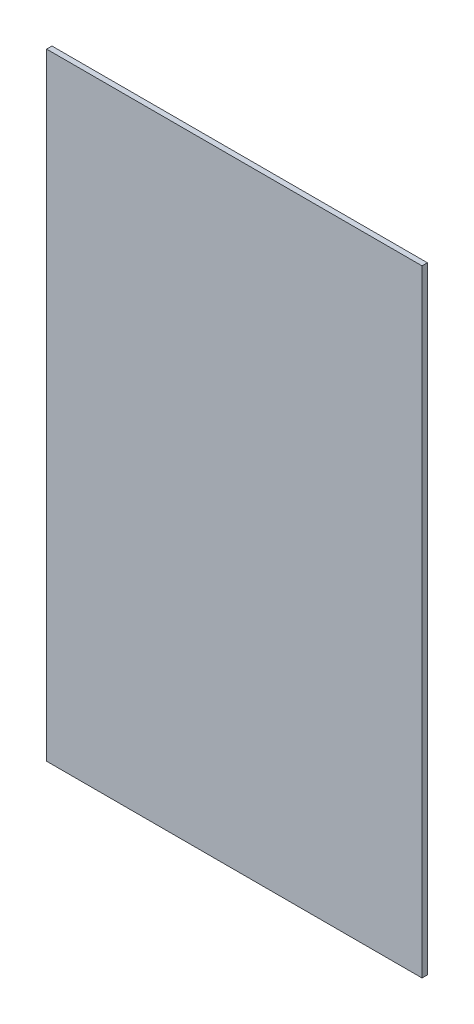
ISO-10303-21;
HEADER;
FILE_DESCRIPTION(('STEP AP214'),'2;1');
FILE_NAME('part.step','',(''),(''),'','','');
FILE_SCHEMA(('AUTOMOTIVE_DESIGN { 1 0 10303 214 1 1 1 1 }'));
ENDSEC;
DATA;
#1=APPLICATION_CONTEXT('core data for automotive mechanical design processes');
#2=APPLICATION_PROTOCOL_DEFINITION('international standard','automotive_design',2000,#1);
#3=PRODUCT_CONTEXT('',#1,'mechanical');
#4=PRODUCT('Part','Part','',(#3));
#5=PRODUCT_RELATED_PRODUCT_CATEGORY('part','',(#4));
#6=PRODUCT_DEFINITION_FORMATION('','',#4);
#7=PRODUCT_DEFINITION_CONTEXT('part definition',#1,'design');
#8=PRODUCT_DEFINITION('design','',#6,#7);
#9=PRODUCT_DEFINITION_SHAPE('','',#8);
#10=(LENGTH_UNIT() NAMED_UNIT(*) SI_UNIT(.MILLI.,.METRE.));
#11=(NAMED_UNIT(*) PLANE_ANGLE_UNIT() SI_UNIT($,.RADIAN.));
#12=(NAMED_UNIT(*) SI_UNIT($,.STERADIAN.) SOLID_ANGLE_UNIT());
#13=UNCERTAINTY_MEASURE_WITH_UNIT(LENGTH_MEASURE(1.E-05),#10,'distance_accuracy_value','');
#14=(GEOMETRIC_REPRESENTATION_CONTEXT(3) GLOBAL_UNCERTAINTY_ASSIGNED_CONTEXT((#13)) GLOBAL_UNIT_ASSIGNED_CONTEXT((#10,
#11,#12)) REPRESENTATION_CONTEXT('',''));
#15=CARTESIAN_POINT('',(0.,0.,0.));
#16=DIRECTION('',(0.,0.,1.));
#17=DIRECTION('',(1.,0.,0.));
#18=AXIS2_PLACEMENT_3D('',#15,#16,#17);
#19=CARTESIAN_POINT('',(-3.571428571429,3.85,0.132857142857));
#20=DIRECTION('',(0.,0.,1.));
#21=DIRECTION('',(1.,0.,0.));
#22=AXIS2_PLACEMENT_3D('',#19,#20,#21);
#23=PLANE('',#22);
#24=DIRECTION('',(1.,0.,0.));
#25=VECTOR('',#24,1.);
#26=CARTESIAN_POINT('',(-2.871428571429,5.,0.132857142857));
#27=LINE('',#26,#25);
#28=CARTESIAN_POINT('',(-3.571428571429,5.,0.132857142857));
#29=VERTEX_POINT('',#28);
#30=CARTESIAN_POINT('',(-2.871428571429,5.,0.132857142857));
#31=VERTEX_POINT('',#30);
#32=EDGE_CURVE('E81',#29,#31,#27,.T.);
#33=ORIENTED_EDGE('',*,*,#32,.T.);
#34=DIRECTION('',(0.,1.,0.));
#35=VECTOR('',#34,1.);
#36=CARTESIAN_POINT('',(-2.871428571429,3.85,0.132857142857));
#37=LINE('',#36,#35);
#38=CARTESIAN_POINT('',(-2.871428571429,3.85,0.132857142857));
#39=VERTEX_POINT('',#38);
#40=EDGE_CURVE('E68',#31,#39,#37,.F.);
#41=ORIENTED_EDGE('',*,*,#40,.T.);
#42=DIRECTION('',(1.,0.,0.));
#43=VECTOR('',#42,1.);
#44=CARTESIAN_POINT('',(-3.571428571429,3.85,0.132857142857));
#45=LINE('',#44,#43);
#46=CARTESIAN_POINT('',(-3.571428571429,3.85,0.132857142857));
#47=VERTEX_POINT('',#46);
#48=EDGE_CURVE('E55',#39,#47,#45,.F.);
#49=ORIENTED_EDGE('',*,*,#48,.T.);
#50=DIRECTION('',(0.,1.,0.));
#51=VECTOR('',#50,1.);
#52=CARTESIAN_POINT('',(-3.571428571429,5.,0.132857142857));
#53=LINE('',#52,#51);
#54=EDGE_CURVE('E20',#47,#29,#53,.T.);
#55=ORIENTED_EDGE('',*,*,#54,.T.);
#56=EDGE_LOOP('',(#33,#41,#49,#55));
#57=FACE_BOUND('',#56,.T.);
#58=ADVANCED_FACE('F17',(#57),#23,.F.);
#59=CARTESIAN_POINT('',(-3.571428571429,5.,0.142857142857));
#60=DIRECTION('',(1.,0.,0.));
#61=DIRECTION('',(0.,0.,-1.));
#62=AXIS2_PLACEMENT_3D('',#59,#60,#61);
#63=PLANE('',#62);
#64=DIRECTION('',(0.,0.,1.));
#65=VECTOR('',#64,1.);
#66=CARTESIAN_POINT('',(-3.571428571429,3.85,0.142857142857));
#67=LINE('',#66,#65);
#68=CARTESIAN_POINT('',(-3.571428571429,3.85,0.142857142857));
#69=VERTEX_POINT('',#68);
#70=EDGE_CURVE('E61',#47,#69,#67,.T.);
#71=ORIENTED_EDGE('',*,*,#70,.T.);
#72=DIRECTION('',(0.,1.,0.));
#73=VECTOR('',#72,1.);
#74=CARTESIAN_POINT('',(-3.571428571429,3.85,0.142857142857));
#75=LINE('',#74,#73);
#76=CARTESIAN_POINT('',(-3.571428571429,5.,0.142857142857));
#77=VERTEX_POINT('',#76);
#78=EDGE_CURVE('E83',#77,#69,#75,.F.);
#79=ORIENTED_EDGE('',*,*,#78,.F.);
#80=DIRECTION('',(0.,0.,-1.));
#81=VECTOR('',#80,1.);
#82=CARTESIAN_POINT('',(-3.571428571429,5.,0.142857142857));
#83=LINE('',#82,#81);
#84=EDGE_CURVE('E64',#77,#29,#83,.T.);
#85=ORIENTED_EDGE('',*,*,#84,.T.);
#86=ORIENTED_EDGE('',*,*,#54,.F.);
#87=EDGE_LOOP('',(#71,#79,#85,#86));
#88=FACE_BOUND('',#87,.T.);
#89=ADVANCED_FACE('F60',(#88),#63,.F.);
#90=CARTESIAN_POINT('',(-3.571428571429,3.85,0.142857142857));
#91=DIRECTION('',(0.,1.,0.));
#92=DIRECTION('',(0.,0.,1.));
#93=AXIS2_PLACEMENT_3D('',#90,#91,#92);
#94=PLANE('',#93);
#95=DIRECTION('',(0.,0.,1.));
#96=VECTOR('',#95,1.);
#97=CARTESIAN_POINT('',(-2.871428571429,3.85,0.142857142857));
#98=LINE('',#97,#96);
#99=CARTESIAN_POINT('',(-2.871428571429,3.85,0.142857142857));
#100=VERTEX_POINT('',#99);
#101=EDGE_CURVE('E70',#39,#100,#98,.T.);
#102=ORIENTED_EDGE('',*,*,#101,.T.);
#103=DIRECTION('',(1.,0.,0.));
#104=VECTOR('',#103,1.);
#105=CARTESIAN_POINT('',(-3.571428571429,3.85,0.142857142857));
#106=LINE('',#105,#104);
#107=EDGE_CURVE('E74',#69,#100,#106,.T.);
#108=ORIENTED_EDGE('',*,*,#107,.F.);
#109=ORIENTED_EDGE('',*,*,#70,.F.);
#110=ORIENTED_EDGE('',*,*,#48,.F.);
#111=EDGE_LOOP('',(#102,#108,#109,#110));
#112=FACE_BOUND('',#111,.T.);
#113=ADVANCED_FACE('F72',(#112),#94,.F.);
#114=CARTESIAN_POINT('',(-2.871428571429,3.85,0.142857142857));
#115=DIRECTION('',(-1.,0.,0.));
#116=DIRECTION('',(0.,0.,1.));
#117=AXIS2_PLACEMENT_3D('',#114,#115,#116);
#118=PLANE('',#117);
#119=DIRECTION('',(0.,0.,-1.));
#120=VECTOR('',#119,1.);
#121=CARTESIAN_POINT('',(-2.871428571429,5.,0.142857142857));
#122=LINE('',#121,#120);
#123=CARTESIAN_POINT('',(-2.871428571429,5.,0.142857142857));
#124=VERTEX_POINT('',#123);
#125=EDGE_CURVE('E35',#31,#124,#122,.F.);
#126=ORIENTED_EDGE('',*,*,#125,.T.);
#127=DIRECTION('',(0.,1.,0.));
#128=VECTOR('',#127,1.);
#129=CARTESIAN_POINT('',(-2.871428571429,3.85,0.142857142857));
#130=LINE('',#129,#128);
#131=EDGE_CURVE('E26',#100,#124,#130,.T.);
#132=ORIENTED_EDGE('',*,*,#131,.F.);
#133=ORIENTED_EDGE('',*,*,#101,.F.);
#134=ORIENTED_EDGE('',*,*,#40,.F.);
#135=EDGE_LOOP('',(#126,#132,#133,#134));
#136=FACE_BOUND('',#135,.T.);
#137=ADVANCED_FACE('F89',(#136),#118,.F.);
#138=CARTESIAN_POINT('',(-2.871428571429,5.,0.142857142857));
#139=DIRECTION('',(0.,-1.,0.));
#140=DIRECTION('',(0.,0.,-1.));
#141=AXIS2_PLACEMENT_3D('',#138,#139,#140);
#142=PLANE('',#141);
#143=ORIENTED_EDGE('',*,*,#84,.F.);
#144=DIRECTION('',(1.,0.,0.));
#145=VECTOR('',#144,1.);
#146=CARTESIAN_POINT('',(-3.571428571429,5.,0.142857142857));
#147=LINE('',#146,#145);
#148=EDGE_CURVE('E11',#124,#77,#147,.F.);
#149=ORIENTED_EDGE('',*,*,#148,.F.);
#150=ORIENTED_EDGE('',*,*,#125,.F.);
#151=ORIENTED_EDGE('',*,*,#32,.F.);
#152=EDGE_LOOP('',(#143,#149,#150,#151));
#153=FACE_BOUND('',#152,.T.);
#154=ADVANCED_FACE('F91',(#153),#142,.F.);
#155=CARTESIAN_POINT('',(-3.571428571429,3.85,0.142857142857));
#156=DIRECTION('',(0.,0.,1.));
#157=DIRECTION('',(1.,0.,0.));
#158=AXIS2_PLACEMENT_3D('',#155,#156,#157);
#159=PLANE('',#158);
#160=ORIENTED_EDGE('',*,*,#131,.T.);
#161=ORIENTED_EDGE('',*,*,#148,.T.);
#162=ORIENTED_EDGE('',*,*,#78,.T.);
#163=ORIENTED_EDGE('',*,*,#107,.T.);
#164=EDGE_LOOP('',(#160,#161,#162,#163));
#165=FACE_BOUND('',#164,.T.);
#166=ADVANCED_FACE('F88',(#165),#159,.T.);
#167=CLOSED_SHELL('',(#58,#89,#113,#137,#154,#166));
#168=MANIFOLD_SOLID_BREP('B1',#167);
#169=ADVANCED_BREP_SHAPE_REPRESENTATION('',(#18,#168),#14);
#170=SHAPE_DEFINITION_REPRESENTATION(#9,#169);
ENDSEC;
END-ISO-10303-21;
